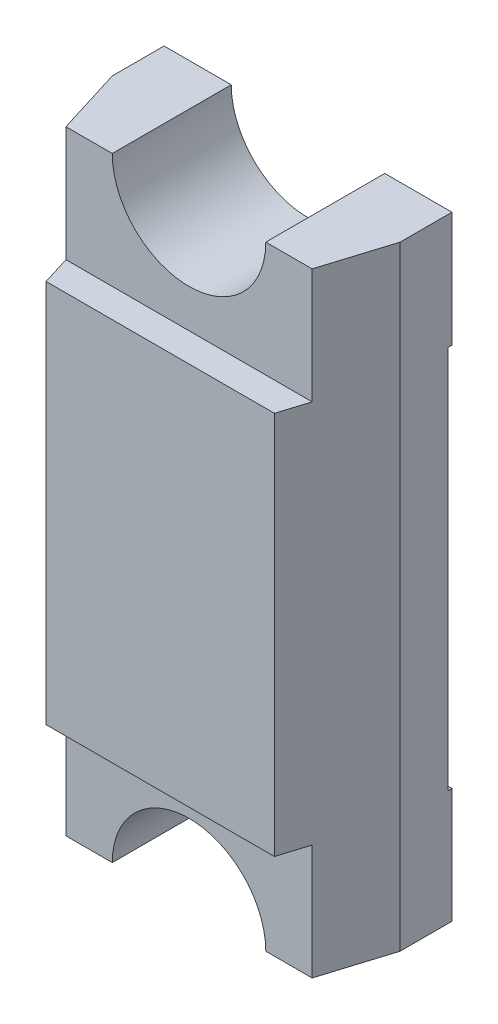
ISO-10303-21;
HEADER;
FILE_DESCRIPTION(('STEP AP214'),'2;1');
FILE_NAME('part.step','',(''),(''),'','','');
FILE_SCHEMA(('AUTOMOTIVE_DESIGN { 1 0 10303 214 1 1 1 1 }'));
ENDSEC;
DATA;
#1=APPLICATION_CONTEXT('core data for automotive mechanical design processes');
#2=APPLICATION_PROTOCOL_DEFINITION('international standard','automotive_design',2000,#1);
#3=PRODUCT_CONTEXT('',#1,'mechanical');
#4=PRODUCT('Part','Part','',(#3));
#5=PRODUCT_RELATED_PRODUCT_CATEGORY('part','',(#4));
#6=PRODUCT_DEFINITION_FORMATION('','',#4);
#7=PRODUCT_DEFINITION_CONTEXT('part definition',#1,'design');
#8=PRODUCT_DEFINITION('design','',#6,#7);
#9=PRODUCT_DEFINITION_SHAPE('','',#8);
#10=(LENGTH_UNIT() NAMED_UNIT(*) SI_UNIT(.MILLI.,.METRE.));
#11=(NAMED_UNIT(*) PLANE_ANGLE_UNIT() SI_UNIT($,.RADIAN.));
#12=(NAMED_UNIT(*) SI_UNIT($,.STERADIAN.) SOLID_ANGLE_UNIT());
#13=UNCERTAINTY_MEASURE_WITH_UNIT(LENGTH_MEASURE(1.E-05),#10,'distance_accuracy_value','');
#14=(GEOMETRIC_REPRESENTATION_CONTEXT(3) GLOBAL_UNCERTAINTY_ASSIGNED_CONTEXT((#13)) GLOBAL_UNIT_ASSIGNED_CONTEXT((#10,
#11,#12)) REPRESENTATION_CONTEXT('',''));
#15=CARTESIAN_POINT('',(0.,0.,0.));
#16=DIRECTION('',(0.,0.,1.));
#17=DIRECTION('',(1.,0.,0.));
#18=AXIS2_PLACEMENT_3D('',#15,#16,#17);
#19=CARTESIAN_POINT('',(0.,-1.6,0.));
#20=DIRECTION('',(0.,0.,-1.));
#21=DIRECTION('',(-1.,0.,0.));
#22=AXIS2_PLACEMENT_3D('',#19,#20,#21);
#23=PLANE('',#22);
#24=DIRECTION('',(0.,-1.,0.));
#25=VECTOR('',#24,1.);
#26=CARTESIAN_POINT('',(-0.0416666666666698,0.458333333333333,0.));
#27=LINE('',#26,#25);
#28=CARTESIAN_POINT('',(-0.0416666666666698,0.458333333333333,0.));
#29=VERTEX_POINT('',#28);
#30=CARTESIAN_POINT('',(-0.0416666666666698,0.013888888888889,0.));
#31=VERTEX_POINT('',#30);
#32=EDGE_CURVE('E636',#29,#31,#27,.T.);
#33=ORIENTED_EDGE('',*,*,#32,.T.);
#34=DIRECTION('',(1.,0.,0.));
#35=VECTOR('',#34,1.);
#36=CARTESIAN_POINT('',(-0.0416666666666698,0.013888888888889,0.));
#37=LINE('',#36,#35);
#38=CARTESIAN_POINT('',(0.173611111111108,0.0138888888888888,0.));
#39=VERTEX_POINT('',#38);
#40=EDGE_CURVE('E633',#31,#39,#37,.T.);
#41=ORIENTED_EDGE('',*,*,#40,.T.);
#42=DIRECTION('',(0.,1.,0.));
#43=VECTOR('',#42,1.);
#44=CARTESIAN_POINT('',(0.173611111111108,0.013888888888889,0.));
#45=LINE('',#44,#43);
#46=CARTESIAN_POINT('',(0.173611111111108,0.458333333333333,0.));
#47=VERTEX_POINT('',#46);
#48=EDGE_CURVE('E630',#39,#47,#45,.T.);
#49=ORIENTED_EDGE('',*,*,#48,.T.);
#50=DIRECTION('',(1.,0.,0.));
#51=VECTOR('',#50,1.);
#52=CARTESIAN_POINT('',(0.173611111111108,0.458333333333333,0.));
#53=LINE('',#52,#51);
#54=CARTESIAN_POINT('',(0.548611111111108,0.458333333333333,0.));
#55=VERTEX_POINT('',#54);
#56=EDGE_CURVE('E627',#47,#55,#53,.T.);
#57=ORIENTED_EDGE('',*,*,#56,.T.);
#58=DIRECTION('',(0.,1.,0.));
#59=VECTOR('',#58,1.);
#60=CARTESIAN_POINT('',(0.548611111111108,0.458333333333333,0.));
#61=LINE('',#60,#59);
#62=CARTESIAN_POINT('',(0.548611111111108,0.513888888888889,0.));
#63=VERTEX_POINT('',#62);
#64=EDGE_CURVE('E624',#55,#63,#61,.T.);
#65=ORIENTED_EDGE('',*,*,#64,.T.);
#66=DIRECTION('',(-1.,0.,0.));
#67=VECTOR('',#66,1.);
#68=CARTESIAN_POINT('',(0.548611111111108,0.513888888888889,0.));
#69=LINE('',#68,#67);
#70=CARTESIAN_POINT('',(-0.41666666666667,0.513888888888889,0.));
#71=VERTEX_POINT('',#70);
#72=EDGE_CURVE('E620',#63,#71,#69,.T.);
#73=ORIENTED_EDGE('',*,*,#72,.T.);
#74=DIRECTION('',(0.,-1.,0.));
#75=VECTOR('',#74,1.);
#76=CARTESIAN_POINT('',(-0.41666666666667,0.513888888888889,0.));
#77=LINE('',#76,#75);
#78=CARTESIAN_POINT('',(-0.41666666666667,0.458333333333333,0.));
#79=VERTEX_POINT('',#78);
#80=EDGE_CURVE('E642',#71,#79,#77,.T.);
#81=ORIENTED_EDGE('',*,*,#80,.T.);
#82=DIRECTION('',(1.,0.,0.));
#83=VECTOR('',#82,1.);
#84=CARTESIAN_POINT('',(-0.41666666666667,0.458333333333333,0.));
#85=LINE('',#84,#83);
#86=EDGE_CURVE('E639',#79,#29,#85,.T.);
#87=ORIENTED_EDGE('',*,*,#86,.T.);
#88=EDGE_LOOP('',(#33,#41,#49,#57,#65,#73,#81,#87));
#89=FACE_BOUND('',#88,.T.);
#90=DIRECTION('',(0.,1.,0.));
#91=VECTOR('',#90,1.);
#92=CARTESIAN_POINT('',(0.75,1.6,0.));
#93=LINE('',#92,#91);
#94=CARTESIAN_POINT('',(0.75,-1.,0.));
#95=VERTEX_POINT('',#94);
#96=CARTESIAN_POINT('',(0.75,1.,0.));
#97=VERTEX_POINT('',#96);
#98=EDGE_CURVE('E728',#95,#97,#93,.T.);
#99=ORIENTED_EDGE('',*,*,#98,.F.);
#100=DIRECTION('',(1.,0.,0.));
#101=VECTOR('',#100,1.);
#102=CARTESIAN_POINT('',(0.75,-1.,0.));
#103=LINE('',#102,#101);
#104=CARTESIAN_POINT('',(-0.75,-1.,0.));
#105=VERTEX_POINT('',#104);
#106=EDGE_CURVE('E544',#105,#95,#103,.T.);
#107=ORIENTED_EDGE('',*,*,#106,.F.);
#108=DIRECTION('',(0.,-1.,0.));
#109=VECTOR('',#108,1.);
#110=CARTESIAN_POINT('',(-0.75,1.6,0.));
#111=LINE('',#110,#109);
#112=CARTESIAN_POINT('',(-0.75,1.,0.));
#113=VERTEX_POINT('',#112);
#114=EDGE_CURVE('E725',#113,#105,#111,.T.);
#115=ORIENTED_EDGE('',*,*,#114,.F.);
#116=DIRECTION('',(-1.,0.,0.));
#117=VECTOR('',#116,1.);
#118=CARTESIAN_POINT('',(0.75,1.,0.));
#119=LINE('',#118,#117);
#120=EDGE_CURVE('E558',#97,#113,#119,.T.);
#121=ORIENTED_EDGE('',*,*,#120,.F.);
#122=EDGE_LOOP('',(#99,#107,#115,#121));
#123=FACE_BOUND('',#122,.T.);
#124=ADVANCED_FACE('F347',(#89,#123),#23,.T.);
#125=CARTESIAN_POINT('',(-0.75,1.6,0.75));
#126=DIRECTION('',(1.,0.,0.));
#127=DIRECTION('',(0.,0.,-1.));
#128=AXIS2_PLACEMENT_3D('',#125,#126,#127);
#129=PLANE('',#128);
#130=DIRECTION('',(0.,0.,-1.));
#131=VECTOR('',#130,1.);
#132=CARTESIAN_POINT('',(-0.75,-1.6,0.75));
#133=LINE('',#132,#131);
#134=CARTESIAN_POINT('',(-0.75,-1.6,0.25));
#135=VERTEX_POINT('',#134);
#136=CARTESIAN_POINT('',(-0.75,-1.6,-0.02));
#137=VERTEX_POINT('',#136);
#138=EDGE_CURVE('E740',#135,#137,#133,.T.);
#139=ORIENTED_EDGE('',*,*,#138,.F.);
#140=DIRECTION('',(0.,1.,0.));
#141=VECTOR('',#140,1.);
#142=CARTESIAN_POINT('',(-0.75,-4.375,0.25));
#143=LINE('',#142,#141);
#144=CARTESIAN_POINT('',(-0.75,1.6,0.25));
#145=VERTEX_POINT('',#144);
#146=EDGE_CURVE('E600',#135,#145,#143,.T.);
#147=ORIENTED_EDGE('',*,*,#146,.T.);
#148=DIRECTION('',(0.,0.,-1.));
#149=VECTOR('',#148,1.);
#150=CARTESIAN_POINT('',(-0.75,1.6,0.75));
#151=LINE('',#150,#149);
#152=CARTESIAN_POINT('',(-0.75,1.6,-0.02));
#153=VERTEX_POINT('',#152);
#154=EDGE_CURVE('E730',#145,#153,#151,.T.);
#155=ORIENTED_EDGE('',*,*,#154,.T.);
#156=DIRECTION('',(0.,1.,0.));
#157=VECTOR('',#156,1.);
#158=CARTESIAN_POINT('',(-0.75,1.6,-0.02));
#159=LINE('',#158,#157);
#160=CARTESIAN_POINT('',(-0.75,1.,-0.02));
#161=VERTEX_POINT('',#160);
#162=EDGE_CURVE('E564',#161,#153,#159,.T.);
#163=ORIENTED_EDGE('',*,*,#162,.F.);
#164=DIRECTION('',(0.,0.,1.));
#165=VECTOR('',#164,1.);
#166=CARTESIAN_POINT('',(-0.75,1.,-0.02));
#167=LINE('',#166,#165);
#168=EDGE_CURVE('E576',#161,#113,#167,.T.);
#169=ORIENTED_EDGE('',*,*,#168,.T.);
#170=ORIENTED_EDGE('',*,*,#114,.T.);
#171=DIRECTION('',(0.,0.,1.));
#172=VECTOR('',#171,1.);
#173=CARTESIAN_POINT('',(-0.75,-1.,-0.02));
#174=LINE('',#173,#172);
#175=CARTESIAN_POINT('',(-0.75,-1.,-0.02));
#176=VERTEX_POINT('',#175);
#177=EDGE_CURVE('E556',#176,#105,#174,.T.);
#178=ORIENTED_EDGE('',*,*,#177,.F.);
#179=DIRECTION('',(0.,1.,0.));
#180=VECTOR('',#179,1.);
#181=CARTESIAN_POINT('',(-0.75,-1.6,-0.02));
#182=LINE('',#181,#180);
#183=EDGE_CURVE('E552',#137,#176,#182,.T.);
#184=ORIENTED_EDGE('',*,*,#183,.F.);
#185=EDGE_LOOP('',(#139,#147,#155,#163,#169,#170,#178,#184));
#186=FACE_BOUND('',#185,.T.);
#187=ADVANCED_FACE('F349',(#186),#129,.F.);
#188=CARTESIAN_POINT('',(-0.75,-1.6,0.75));
#189=DIRECTION('',(0.,1.,0.));
#190=DIRECTION('',(0.,0.,1.));
#191=AXIS2_PLACEMENT_3D('',#188,#189,#190);
#192=PLANE('',#191);
#193=DIRECTION('',(1.,0.,0.));
#194=VECTOR('',#193,1.);
#195=CARTESIAN_POINT('',(-0.751,-1.6,0.6));
#196=LINE('',#195,#194);
#197=CARTESIAN_POINT('',(-0.641511286589969,-1.6,0.6));
#198=VERTEX_POINT('',#197);
#199=CARTESIAN_POINT('',(-0.4,-1.6,0.6));
#200=VERTEX_POINT('',#199);
#201=EDGE_CURVE('E704',#198,#200,#196,.T.);
#202=ORIENTED_EDGE('',*,*,#201,.F.);
#203=DIRECTION('',(-0.296070669880944,0.,-0.955166037103628));
#204=VECTOR('',#203,1.);
#205=CARTESIAN_POINT('',(-0.608601675773601,-1.6,0.706171079218124));
#206=LINE('',#205,#204);
#207=EDGE_CURVE('E607',#198,#135,#206,.T.);
#208=ORIENTED_EDGE('',*,*,#207,.T.);
#209=ORIENTED_EDGE('',*,*,#138,.T.);
#210=DIRECTION('',(-1.,0.,0.));
#211=VECTOR('',#210,1.);
#212=CARTESIAN_POINT('',(-0.4,-1.6,-0.02));
#213=LINE('',#212,#211);
#214=CARTESIAN_POINT('',(-0.4,-1.6,-0.02));
#215=VERTEX_POINT('',#214);
#216=EDGE_CURVE('E549',#215,#137,#213,.T.);
#217=ORIENTED_EDGE('',*,*,#216,.F.);
#218=DIRECTION('',(0.,0.,-1.));
#219=VECTOR('',#218,1.);
#220=CARTESIAN_POINT('',(-0.4,-1.6,0.75));
#221=LINE('',#220,#219);
#222=EDGE_CURVE('E738',#200,#215,#221,.T.);
#223=ORIENTED_EDGE('',*,*,#222,.F.);
#224=EDGE_LOOP('',(#202,#208,#209,#217,#223));
#225=FACE_BOUND('',#224,.T.);
#226=ADVANCED_FACE('F759',(#225),#192,.F.);
#227=CARTESIAN_POINT('',(0.,-1.6,0.75));
#228=DIRECTION('',(0.,0.,-1.));
#229=DIRECTION('',(-1.,0.,0.));
#230=AXIS2_PLACEMENT_3D('',#227,#228,#229);
#231=CYLINDRICAL_SURFACE('',#230,0.4);
#232=DIRECTION('',(0.,0.,-1.));
#233=VECTOR('',#232,1.);
#234=CARTESIAN_POINT('',(0.4,-1.6,0.75));
#235=LINE('',#234,#233);
#236=CARTESIAN_POINT('',(0.4,-1.6,0.6));
#237=VERTEX_POINT('',#236);
#238=CARTESIAN_POINT('',(0.4,-1.6,-0.02));
#239=VERTEX_POINT('',#238);
#240=EDGE_CURVE('E528',#237,#239,#235,.T.);
#241=ORIENTED_EDGE('',*,*,#240,.F.);
#242=CARTESIAN_POINT('',(0.,-1.6,0.6));
#243=DIRECTION('',(0.,0.,-1.));
#244=DIRECTION('',(-1.,0.,0.));
#245=AXIS2_PLACEMENT_3D('',#242,#243,#244);
#246=CIRCLE('',#245,0.4);
#247=EDGE_CURVE('E702',#200,#237,#246,.T.);
#248=ORIENTED_EDGE('',*,*,#247,.F.);
#249=ORIENTED_EDGE('',*,*,#222,.T.);
#250=CARTESIAN_POINT('',(0.,-1.6,-0.02));
#251=DIRECTION('',(0.,0.,1.));
#252=DIRECTION('',(1.,0.,0.));
#253=AXIS2_PLACEMENT_3D('',#250,#251,#252);
#254=CIRCLE('',#253,0.4);
#255=EDGE_CURVE('E539',#239,#215,#254,.T.);
#256=ORIENTED_EDGE('',*,*,#255,.F.);
#257=EDGE_LOOP('',(#241,#248,#249,#256));
#258=FACE_BOUND('',#257,.T.);
#259=ADVANCED_FACE('F754',(#258),#231,.F.);
#260=CARTESIAN_POINT('',(0.4,-1.6,0.75));
#261=DIRECTION('',(0.,1.,0.));
#262=DIRECTION('',(0.,0.,1.));
#263=AXIS2_PLACEMENT_3D('',#260,#261,#262);
#264=PLANE('',#263);
#265=DIRECTION('',(0.,0.,-1.));
#266=VECTOR('',#265,1.);
#267=CARTESIAN_POINT('',(0.75,-1.6,0.75));
#268=LINE('',#267,#266);
#269=CARTESIAN_POINT('',(0.75,-1.6,0.25));
#270=VERTEX_POINT('',#269);
#271=CARTESIAN_POINT('',(0.75,-1.6,-0.02));
#272=VERTEX_POINT('',#271);
#273=EDGE_CURVE('E519',#270,#272,#268,.T.);
#274=ORIENTED_EDGE('',*,*,#273,.F.);
#275=DIRECTION('',(-0.296070669880953,0.,0.955166037103625));
#276=VECTOR('',#275,1.);
#277=CARTESIAN_POINT('',(0.577921431226282,-1.6,0.805149906176604));
#278=LINE('',#277,#276);
#279=CARTESIAN_POINT('',(0.641511286589965,-1.6,0.6));
#280=VERTEX_POINT('',#279);
#281=EDGE_CURVE('E588',#270,#280,#278,.T.);
#282=ORIENTED_EDGE('',*,*,#281,.T.);
#283=DIRECTION('',(1.,0.,0.));
#284=VECTOR('',#283,1.);
#285=CARTESIAN_POINT('',(-0.751,-1.6,0.6));
#286=LINE('',#285,#284);
#287=EDGE_CURVE('E697',#237,#280,#286,.T.);
#288=ORIENTED_EDGE('',*,*,#287,.F.);
#289=ORIENTED_EDGE('',*,*,#240,.T.);
#290=DIRECTION('',(-1.,0.,0.));
#291=VECTOR('',#290,1.);
#292=CARTESIAN_POINT('',(0.75,-1.6,-0.02));
#293=LINE('',#292,#291);
#294=EDGE_CURVE('E532',#272,#239,#293,.T.);
#295=ORIENTED_EDGE('',*,*,#294,.F.);
#296=EDGE_LOOP('',(#274,#282,#288,#289,#295));
#297=FACE_BOUND('',#296,.T.);
#298=ADVANCED_FACE('F533',(#297),#264,.F.);
#299=CARTESIAN_POINT('',(0.75,1.6,0.75));
#300=DIRECTION('',(-1.,0.,0.));
#301=DIRECTION('',(0.,0.,1.));
#302=AXIS2_PLACEMENT_3D('',#299,#300,#301);
#303=PLANE('',#302);
#304=DIRECTION('',(0.,0.,-1.));
#305=VECTOR('',#304,1.);
#306=CARTESIAN_POINT('',(0.75,1.6,0.75));
#307=LINE('',#306,#305);
#308=CARTESIAN_POINT('',(0.75,1.6,0.25));
#309=VERTEX_POINT('',#308);
#310=CARTESIAN_POINT('',(0.75,1.6,-0.02));
#311=VERTEX_POINT('',#310);
#312=EDGE_CURVE('E529',#309,#311,#307,.T.);
#313=ORIENTED_EDGE('',*,*,#312,.F.);
#314=DIRECTION('',(0.,1.,0.));
#315=VECTOR('',#314,1.);
#316=CARTESIAN_POINT('',(0.75,-4.375,0.25));
#317=LINE('',#316,#315);
#318=EDGE_CURVE('E525',#270,#309,#317,.T.);
#319=ORIENTED_EDGE('',*,*,#318,.F.);
#320=ORIENTED_EDGE('',*,*,#273,.T.);
#321=DIRECTION('',(0.,-1.,0.));
#322=VECTOR('',#321,1.);
#323=CARTESIAN_POINT('',(0.75,-1.,-0.02));
#324=LINE('',#323,#322);
#325=CARTESIAN_POINT('',(0.75,-1.,-0.02));
#326=VERTEX_POINT('',#325);
#327=EDGE_CURVE('E524',#326,#272,#324,.T.);
#328=ORIENTED_EDGE('',*,*,#327,.F.);
#329=DIRECTION('',(0.,0.,1.));
#330=VECTOR('',#329,1.);
#331=CARTESIAN_POINT('',(0.75,-1.,-0.02));
#332=LINE('',#331,#330);
#333=EDGE_CURVE('E362',#326,#95,#332,.T.);
#334=ORIENTED_EDGE('',*,*,#333,.T.);
#335=ORIENTED_EDGE('',*,*,#98,.T.);
#336=DIRECTION('',(0.,0.,1.));
#337=VECTOR('',#336,1.);
#338=CARTESIAN_POINT('',(0.75,1.,-0.02));
#339=LINE('',#338,#337);
#340=CARTESIAN_POINT('',(0.75,1.,-0.02));
#341=VERTEX_POINT('',#340);
#342=EDGE_CURVE('E580',#341,#97,#339,.T.);
#343=ORIENTED_EDGE('',*,*,#342,.F.);
#344=DIRECTION('',(0.,-1.,0.));
#345=VECTOR('',#344,1.);
#346=CARTESIAN_POINT('',(0.75,1.,-0.02));
#347=LINE('',#346,#345);
#348=EDGE_CURVE('E559',#311,#341,#347,.T.);
#349=ORIENTED_EDGE('',*,*,#348,.F.);
#350=EDGE_LOOP('',(#313,#319,#320,#328,#334,#335,#343,#349));
#351=FACE_BOUND('',#350,.T.);
#352=ADVANCED_FACE('F522',(#351),#303,.F.);
#353=CARTESIAN_POINT('',(0.4,1.6,0.75));
#354=DIRECTION('',(0.,-1.,0.));
#355=DIRECTION('',(0.,0.,-1.));
#356=AXIS2_PLACEMENT_3D('',#353,#354,#355);
#357=PLANE('',#356);
#358=DIRECTION('',(-1.,0.,0.));
#359=VECTOR('',#358,1.);
#360=CARTESIAN_POINT('',(-0.751,1.6,0.6));
#361=LINE('',#360,#359);
#362=CARTESIAN_POINT('',(0.641511286589965,1.6,0.6));
#363=VERTEX_POINT('',#362);
#364=CARTESIAN_POINT('',(0.4,1.6,0.6));
#365=VERTEX_POINT('',#364);
#366=EDGE_CURVE('E710',#363,#365,#361,.T.);
#367=ORIENTED_EDGE('',*,*,#366,.F.);
#368=DIRECTION('',(0.296070669880953,0.,-0.955166037103625));
#369=VECTOR('',#368,1.);
#370=CARTESIAN_POINT('',(0.577921431226282,1.6,0.805149906176604));
#371=LINE('',#370,#369);
#372=EDGE_CURVE('E596',#363,#309,#371,.T.);
#373=ORIENTED_EDGE('',*,*,#372,.T.);
#374=ORIENTED_EDGE('',*,*,#312,.T.);
#375=DIRECTION('',(1.,0.,0.));
#376=VECTOR('',#375,1.);
#377=CARTESIAN_POINT('',(0.75,1.6,-0.02));
#378=LINE('',#377,#376);
#379=CARTESIAN_POINT('',(0.4,1.6,-0.02));
#380=VERTEX_POINT('',#379);
#381=EDGE_CURVE('E573',#380,#311,#378,.T.);
#382=ORIENTED_EDGE('',*,*,#381,.F.);
#383=DIRECTION('',(0.,0.,-1.));
#384=VECTOR('',#383,1.);
#385=CARTESIAN_POINT('',(0.4,1.6,0.75));
#386=LINE('',#385,#384);
#387=EDGE_CURVE('E734',#365,#380,#386,.T.);
#388=ORIENTED_EDGE('',*,*,#387,.F.);
#389=EDGE_LOOP('',(#367,#373,#374,#382,#388));
#390=FACE_BOUND('',#389,.T.);
#391=ADVANCED_FACE('F782',(#390),#357,.F.);
#392=CARTESIAN_POINT('',(0.,1.6,0.75));
#393=DIRECTION('',(0.,0.,-1.));
#394=DIRECTION('',(-1.,0.,0.));
#395=AXIS2_PLACEMENT_3D('',#392,#393,#394);
#396=CYLINDRICAL_SURFACE('',#395,0.4);
#397=DIRECTION('',(0.,0.,-1.));
#398=VECTOR('',#397,1.);
#399=CARTESIAN_POINT('',(-0.4,1.6,0.75));
#400=LINE('',#399,#398);
#401=CARTESIAN_POINT('',(-0.4,1.6,0.6));
#402=VERTEX_POINT('',#401);
#403=CARTESIAN_POINT('',(-0.4,1.6,-0.02));
#404=VERTEX_POINT('',#403);
#405=EDGE_CURVE('E732',#402,#404,#400,.T.);
#406=ORIENTED_EDGE('',*,*,#405,.F.);
#407=CARTESIAN_POINT('',(0.,1.6,0.6));
#408=DIRECTION('',(0.,0.,-1.));
#409=DIRECTION('',(-1.,0.,0.));
#410=AXIS2_PLACEMENT_3D('',#407,#408,#409);
#411=CIRCLE('',#410,0.4);
#412=EDGE_CURVE('E723',#365,#402,#411,.T.);
#413=ORIENTED_EDGE('',*,*,#412,.F.);
#414=ORIENTED_EDGE('',*,*,#387,.T.);
#415=CARTESIAN_POINT('',(0.,1.6,-0.02));
#416=DIRECTION('',(0.,0.,1.));
#417=DIRECTION('',(-1.,0.,0.));
#418=AXIS2_PLACEMENT_3D('',#415,#416,#417);
#419=CIRCLE('',#418,0.4);
#420=EDGE_CURVE('E570',#404,#380,#419,.T.);
#421=ORIENTED_EDGE('',*,*,#420,.F.);
#422=EDGE_LOOP('',(#406,#413,#414,#421));
#423=FACE_BOUND('',#422,.T.);
#424=ADVANCED_FACE('F800',(#423),#396,.F.);
#425=CARTESIAN_POINT('',(-0.75,1.6,0.75));
#426=DIRECTION('',(0.,-1.,0.));
#427=DIRECTION('',(0.,0.,-1.));
#428=AXIS2_PLACEMENT_3D('',#425,#426,#427);
#429=PLANE('',#428);
#430=ORIENTED_EDGE('',*,*,#154,.F.);
#431=DIRECTION('',(0.296070669880944,0.,0.955166037103628));
#432=VECTOR('',#431,1.);
#433=CARTESIAN_POINT('',(-0.608601675773601,1.6,0.706171079218124));
#434=LINE('',#433,#432);
#435=CARTESIAN_POINT('',(-0.641511286589969,1.6,0.6));
#436=VERTEX_POINT('',#435);
#437=EDGE_CURVE('E616',#145,#436,#434,.T.);
#438=ORIENTED_EDGE('',*,*,#437,.T.);
#439=DIRECTION('',(-1.,0.,0.));
#440=VECTOR('',#439,1.);
#441=CARTESIAN_POINT('',(-0.751,1.6,0.6));
#442=LINE('',#441,#440);
#443=EDGE_CURVE('E718',#402,#436,#442,.T.);
#444=ORIENTED_EDGE('',*,*,#443,.F.);
#445=ORIENTED_EDGE('',*,*,#405,.T.);
#446=DIRECTION('',(1.,0.,0.));
#447=VECTOR('',#446,1.);
#448=CARTESIAN_POINT('',(-0.4,1.6,-0.02));
#449=LINE('',#448,#447);
#450=EDGE_CURVE('E567',#153,#404,#449,.T.);
#451=ORIENTED_EDGE('',*,*,#450,.F.);
#452=EDGE_LOOP('',(#430,#438,#444,#445,#451));
#453=FACE_BOUND('',#452,.T.);
#454=ADVANCED_FACE('F796',(#453),#429,.F.);
#455=CARTESIAN_POINT('',(0.,-1.6,0.75));
#456=DIRECTION('',(0.,0.,-1.));
#457=DIRECTION('',(-1.,0.,0.));
#458=AXIS2_PLACEMENT_3D('',#455,#456,#457);
#459=PLANE('',#458);
#460=DIRECTION('',(1.,0.,0.));
#461=VECTOR('',#460,1.);
#462=CARTESIAN_POINT('',(-0.751,-1.,0.75));
#463=LINE('',#462,#461);
#464=CARTESIAN_POINT('',(-0.595016123699956,-1.,0.75));
#465=VERTEX_POINT('',#464);
#466=CARTESIAN_POINT('',(0.595016123699949,-1.,0.75));
#467=VERTEX_POINT('',#466);
#468=EDGE_CURVE('E707',#465,#467,#463,.T.);
#469=ORIENTED_EDGE('',*,*,#468,.T.);
#470=DIRECTION('',(0.,1.,0.));
#471=VECTOR('',#470,1.);
#472=CARTESIAN_POINT('',(0.595016123699949,-4.375,0.750000000000005));
#473=LINE('',#472,#471);
#474=CARTESIAN_POINT('',(0.595016123699949,1.,0.750000000000005));
#475=VERTEX_POINT('',#474);
#476=EDGE_CURVE('E370',#467,#475,#473,.T.);
#477=ORIENTED_EDGE('',*,*,#476,.T.);
#478=DIRECTION('',(1.,0.,0.));
#479=VECTOR('',#478,1.);
#480=CARTESIAN_POINT('',(-0.751,1.,0.75));
#481=LINE('',#480,#479);
#482=CARTESIAN_POINT('',(-0.595016123699956,1.,0.75));
#483=VERTEX_POINT('',#482);
#484=EDGE_CURVE('E715',#483,#475,#481,.T.);
#485=ORIENTED_EDGE('',*,*,#484,.F.);
#486=DIRECTION('',(0.,1.,0.));
#487=VECTOR('',#486,1.);
#488=CARTESIAN_POINT('',(-0.595016123699956,-4.375,0.75));
#489=LINE('',#488,#487);
#490=EDGE_CURVE('E599',#465,#483,#489,.T.);
#491=ORIENTED_EDGE('',*,*,#490,.F.);
#492=EDGE_LOOP('',(#469,#477,#485,#491));
#493=FACE_BOUND('',#492,.T.);
#494=ADVANCED_FACE('F792',(#493),#459,.F.);
#495=CARTESIAN_POINT('',(-0.751,1.,0.6));
#496=DIRECTION('',(0.,-1.,0.));
#497=DIRECTION('',(0.,0.,-1.));
#498=AXIS2_PLACEMENT_3D('',#495,#496,#497);
#499=PLANE('',#498);
#500=ORIENTED_EDGE('',*,*,#484,.T.);
#501=DIRECTION('',(0.296070669880953,0.,-0.955166037103625));
#502=VECTOR('',#501,1.);
#503=CARTESIAN_POINT('',(0.51944675285432,1.,0.993797524780347));
#504=LINE('',#503,#502);
#505=CARTESIAN_POINT('',(0.641511286589965,1.,0.6));
#506=VERTEX_POINT('',#505);
#507=EDGE_CURVE('E593',#475,#506,#504,.T.);
#508=ORIENTED_EDGE('',*,*,#507,.T.);
#509=DIRECTION('',(1.,0.,0.));
#510=VECTOR('',#509,1.);
#511=CARTESIAN_POINT('',(-0.751,1.,0.6));
#512=LINE('',#511,#510);
#513=CARTESIAN_POINT('',(-0.641511286589969,1.,0.6));
#514=VERTEX_POINT('',#513);
#515=EDGE_CURVE('E714',#514,#506,#512,.T.);
#516=ORIENTED_EDGE('',*,*,#515,.F.);
#517=DIRECTION('',(0.296070669880944,0.,0.955166037103628));
#518=VECTOR('',#517,1.);
#519=CARTESIAN_POINT('',(-0.651108830883084,1.,0.569036958804234));
#520=LINE('',#519,#518);
#521=EDGE_CURVE('E613',#514,#483,#520,.T.);
#522=ORIENTED_EDGE('',*,*,#521,.T.);
#523=EDGE_LOOP('',(#500,#508,#516,#522));
#524=FACE_BOUND('',#523,.T.);
#525=ADVANCED_FACE('F789',(#524),#499,.F.);
#526=CARTESIAN_POINT('',(-0.751,1.,0.6));
#527=DIRECTION('',(0.,0.,-1.));
#528=DIRECTION('',(-1.,0.,0.));
#529=AXIS2_PLACEMENT_3D('',#526,#527,#528);
#530=PLANE('',#529);
#531=ORIENTED_EDGE('',*,*,#515,.T.);
#532=DIRECTION('',(0.,1.,0.));
#533=VECTOR('',#532,1.);
#534=CARTESIAN_POINT('',(0.641511286589965,1.,0.6));
#535=LINE('',#534,#533);
#536=EDGE_CURVE('E590',#506,#363,#535,.T.);
#537=ORIENTED_EDGE('',*,*,#536,.T.);
#538=ORIENTED_EDGE('',*,*,#366,.T.);
#539=ORIENTED_EDGE('',*,*,#412,.T.);
#540=ORIENTED_EDGE('',*,*,#443,.T.);
#541=DIRECTION('',(0.,-1.,0.));
#542=VECTOR('',#541,1.);
#543=CARTESIAN_POINT('',(-0.641511286589969,1.,0.6));
#544=LINE('',#543,#542);
#545=EDGE_CURVE('E610',#436,#514,#544,.T.);
#546=ORIENTED_EDGE('',*,*,#545,.T.);
#547=EDGE_LOOP('',(#531,#537,#538,#539,#540,#546));
#548=FACE_BOUND('',#547,.T.);
#549=ADVANCED_FACE('F785',(#548),#530,.F.);
#550=CARTESIAN_POINT('',(-0.751,-1.,0.6));
#551=DIRECTION('',(0.,0.,-1.));
#552=DIRECTION('',(-1.,0.,0.));
#553=AXIS2_PLACEMENT_3D('',#550,#551,#552);
#554=PLANE('',#553);
#555=ORIENTED_EDGE('',*,*,#287,.T.);
#556=DIRECTION('',(0.,1.,0.));
#557=VECTOR('',#556,1.);
#558=CARTESIAN_POINT('',(0.641511286589965,-1.,0.6));
#559=LINE('',#558,#557);
#560=CARTESIAN_POINT('',(0.641511286589965,-1.,0.6));
#561=VERTEX_POINT('',#560);
#562=EDGE_CURVE('E584',#280,#561,#559,.T.);
#563=ORIENTED_EDGE('',*,*,#562,.T.);
#564=DIRECTION('',(1.,0.,0.));
#565=VECTOR('',#564,1.);
#566=CARTESIAN_POINT('',(-0.751,-1.,0.6));
#567=LINE('',#566,#565);
#568=CARTESIAN_POINT('',(-0.641511286589969,-1.,0.6));
#569=VERTEX_POINT('',#568);
#570=EDGE_CURVE('E706',#569,#561,#567,.T.);
#571=ORIENTED_EDGE('',*,*,#570,.F.);
#572=DIRECTION('',(0.,-1.,0.));
#573=VECTOR('',#572,1.);
#574=CARTESIAN_POINT('',(-0.641511286589969,-1.,0.6));
#575=LINE('',#574,#573);
#576=EDGE_CURVE('E603',#569,#198,#575,.T.);
#577=ORIENTED_EDGE('',*,*,#576,.T.);
#578=ORIENTED_EDGE('',*,*,#201,.T.);
#579=ORIENTED_EDGE('',*,*,#247,.T.);
#580=EDGE_LOOP('',(#555,#563,#571,#577,#578,#579));
#581=FACE_BOUND('',#580,.T.);
#582=ADVANCED_FACE('F749',(#581),#554,.F.);
#583=CARTESIAN_POINT('',(-0.751,-1.,0.6));
#584=DIRECTION('',(0.,1.,0.));
#585=DIRECTION('',(0.,0.,1.));
#586=AXIS2_PLACEMENT_3D('',#583,#584,#585);
#587=PLANE('',#586);
#588=ORIENTED_EDGE('',*,*,#570,.T.);
#589=DIRECTION('',(-0.296070669880953,0.,0.955166037103625));
#590=VECTOR('',#589,1.);
#591=CARTESIAN_POINT('',(0.51944675285432,-1.,0.993797524780347));
#592=LINE('',#591,#590);
#593=EDGE_CURVE('E13',#561,#467,#592,.T.);
#594=ORIENTED_EDGE('',*,*,#593,.T.);
#595=ORIENTED_EDGE('',*,*,#468,.F.);
#596=DIRECTION('',(-0.296070669880944,0.,-0.955166037103628));
#597=VECTOR('',#596,1.);
#598=CARTESIAN_POINT('',(-0.651108830883084,-1.,0.569036958804234));
#599=LINE('',#598,#597);
#600=EDGE_CURVE('E355',#465,#569,#599,.T.);
#601=ORIENTED_EDGE('',*,*,#600,.T.);
#602=EDGE_LOOP('',(#588,#594,#595,#601));
#603=FACE_BOUND('',#602,.T.);
#604=ADVANCED_FACE('F745',(#603),#587,.F.);
#605=CARTESIAN_POINT('',(-0.0416666666666698,0.458333333333333,0.));
#606=DIRECTION('',(1.,0.,0.));
#607=DIRECTION('',(0.,-1.,0.));
#608=AXIS2_PLACEMENT_3D('',#605,#606,#607);
#609=PLANE('',#608);
#610=DIRECTION('',(0.,0.,1.));
#611=VECTOR('',#610,1.);
#612=CARTESIAN_POINT('',(-0.0416666666666698,0.458333333333333,0.));
#613=LINE('',#612,#611);
#614=CARTESIAN_POINT('',(-0.0416666666666698,0.458333333333333,-0.01));
#615=VERTEX_POINT('',#614);
#616=EDGE_CURVE('E694',#615,#29,#613,.T.);
#617=ORIENTED_EDGE('',*,*,#616,.F.);
#618=DIRECTION('',(0.,1.,0.));
#619=VECTOR('',#618,1.);
#620=CARTESIAN_POINT('',(-0.0416666666666698,-1.6,-0.01));
#621=LINE('',#620,#619);
#622=CARTESIAN_POINT('',(-0.0416666666666698,0.013888888888889,-0.01));
#623=VERTEX_POINT('',#622);
#624=EDGE_CURVE('E669',#615,#623,#621,.F.);
#625=ORIENTED_EDGE('',*,*,#624,.T.);
#626=DIRECTION('',(0.,0.,1.));
#627=VECTOR('',#626,1.);
#628=CARTESIAN_POINT('',(-0.0416666666666698,0.013888888888889,0.));
#629=LINE('',#628,#627);
#630=EDGE_CURVE('E691',#623,#31,#629,.T.);
#631=ORIENTED_EDGE('',*,*,#630,.T.);
#632=ORIENTED_EDGE('',*,*,#32,.F.);
#633=EDGE_LOOP('',(#617,#625,#631,#632));
#634=FACE_BOUND('',#633,.T.);
#635=ADVANCED_FACE('F827',(#634),#609,.F.);
#636=CARTESIAN_POINT('',(-0.0416666666666698,0.013888888888889,0.));
#637=DIRECTION('',(0.,1.,0.));
#638=DIRECTION('',(1.,0.,0.));
#639=AXIS2_PLACEMENT_3D('',#636,#637,#638);
#640=PLANE('',#639);
#641=ORIENTED_EDGE('',*,*,#630,.F.);
#642=DIRECTION('',(-1.,0.,0.));
#643=VECTOR('',#642,1.);
#644=CARTESIAN_POINT('',(0.,0.013888888888889,-0.01));
#645=LINE('',#644,#643);
#646=CARTESIAN_POINT('',(0.173611111111108,0.013888888888889,-0.01));
#647=VERTEX_POINT('',#646);
#648=EDGE_CURVE('E665',#623,#647,#645,.F.);
#649=ORIENTED_EDGE('',*,*,#648,.T.);
#650=DIRECTION('',(0.,0.,1.));
#651=VECTOR('',#650,1.);
#652=CARTESIAN_POINT('',(0.173611111111108,0.013888888888889,0.));
#653=LINE('',#652,#651);
#654=EDGE_CURVE('E688',#647,#39,#653,.T.);
#655=ORIENTED_EDGE('',*,*,#654,.T.);
#656=ORIENTED_EDGE('',*,*,#40,.F.);
#657=EDGE_LOOP('',(#641,#649,#655,#656));
#658=FACE_BOUND('',#657,.T.);
#659=ADVANCED_FACE('F836',(#658),#640,.F.);
#660=CARTESIAN_POINT('',(0.173611111111108,0.013888888888889,0.));
#661=DIRECTION('',(-1.,0.,0.));
#662=DIRECTION('',(0.,1.,0.));
#663=AXIS2_PLACEMENT_3D('',#660,#661,#662);
#664=PLANE('',#663);
#665=ORIENTED_EDGE('',*,*,#654,.F.);
#666=DIRECTION('',(0.,1.,0.));
#667=VECTOR('',#666,1.);
#668=CARTESIAN_POINT('',(0.173611111111108,-1.6,-0.01));
#669=LINE('',#668,#667);
#670=CARTESIAN_POINT('',(0.173611111111108,0.458333333333333,-0.01));
#671=VERTEX_POINT('',#670);
#672=EDGE_CURVE('E661',#647,#671,#669,.T.);
#673=ORIENTED_EDGE('',*,*,#672,.T.);
#674=DIRECTION('',(0.,0.,1.));
#675=VECTOR('',#674,1.);
#676=CARTESIAN_POINT('',(0.173611111111108,0.458333333333333,0.));
#677=LINE('',#676,#675);
#678=EDGE_CURVE('E685',#671,#47,#677,.T.);
#679=ORIENTED_EDGE('',*,*,#678,.T.);
#680=ORIENTED_EDGE('',*,*,#48,.F.);
#681=EDGE_LOOP('',(#665,#673,#679,#680));
#682=FACE_BOUND('',#681,.T.);
#683=ADVANCED_FACE('F840',(#682),#664,.F.);
#684=CARTESIAN_POINT('',(0.173611111111108,0.458333333333333,0.));
#685=DIRECTION('',(0.,1.,0.));
#686=DIRECTION('',(1.,0.,0.));
#687=AXIS2_PLACEMENT_3D('',#684,#685,#686);
#688=PLANE('',#687);
#689=ORIENTED_EDGE('',*,*,#678,.F.);
#690=DIRECTION('',(-1.,0.,0.));
#691=VECTOR('',#690,1.);
#692=CARTESIAN_POINT('',(0.,0.458333333333333,-0.01));
#693=LINE('',#692,#691);
#694=CARTESIAN_POINT('',(0.548611111111108,0.458333333333333,-0.01));
#695=VERTEX_POINT('',#694);
#696=EDGE_CURVE('E657',#671,#695,#693,.F.);
#697=ORIENTED_EDGE('',*,*,#696,.T.);
#698=DIRECTION('',(0.,0.,1.));
#699=VECTOR('',#698,1.);
#700=CARTESIAN_POINT('',(0.548611111111108,0.458333333333333,0.));
#701=LINE('',#700,#699);
#702=EDGE_CURVE('E682',#695,#55,#701,.T.);
#703=ORIENTED_EDGE('',*,*,#702,.T.);
#704=ORIENTED_EDGE('',*,*,#56,.F.);
#705=EDGE_LOOP('',(#689,#697,#703,#704));
#706=FACE_BOUND('',#705,.T.);
#707=ADVANCED_FACE('F844',(#706),#688,.F.);
#708=CARTESIAN_POINT('',(0.548611111111108,0.458333333333333,0.));
#709=DIRECTION('',(-1.,0.,0.));
#710=DIRECTION('',(0.,1.,0.));
#711=AXIS2_PLACEMENT_3D('',#708,#709,#710);
#712=PLANE('',#711);
#713=ORIENTED_EDGE('',*,*,#702,.F.);
#714=DIRECTION('',(0.,1.,0.));
#715=VECTOR('',#714,1.);
#716=CARTESIAN_POINT('',(0.548611111111108,-1.6,-0.01));
#717=LINE('',#716,#715);
#718=CARTESIAN_POINT('',(0.548611111111108,0.513888888888889,-0.01));
#719=VERTEX_POINT('',#718);
#720=EDGE_CURVE('E653',#695,#719,#717,.T.);
#721=ORIENTED_EDGE('',*,*,#720,.T.);
#722=DIRECTION('',(0.,0.,1.));
#723=VECTOR('',#722,1.);
#724=CARTESIAN_POINT('',(0.548611111111108,0.513888888888889,0.));
#725=LINE('',#724,#723);
#726=EDGE_CURVE('E679',#719,#63,#725,.T.);
#727=ORIENTED_EDGE('',*,*,#726,.T.);
#728=ORIENTED_EDGE('',*,*,#64,.F.);
#729=EDGE_LOOP('',(#713,#721,#727,#728));
#730=FACE_BOUND('',#729,.T.);
#731=ADVANCED_FACE('F848',(#730),#712,.F.);
#732=CARTESIAN_POINT('',(0.548611111111108,0.513888888888889,0.));
#733=DIRECTION('',(0.,-1.,0.));
#734=DIRECTION('',(-1.,0.,0.));
#735=AXIS2_PLACEMENT_3D('',#732,#733,#734);
#736=PLANE('',#735);
#737=ORIENTED_EDGE('',*,*,#726,.F.);
#738=DIRECTION('',(-1.,0.,0.));
#739=VECTOR('',#738,1.);
#740=CARTESIAN_POINT('',(0.,0.513888888888889,-0.01));
#741=LINE('',#740,#739);
#742=CARTESIAN_POINT('',(-0.41666666666667,0.513888888888889,-0.01));
#743=VERTEX_POINT('',#742);
#744=EDGE_CURVE('E645',#719,#743,#741,.T.);
#745=ORIENTED_EDGE('',*,*,#744,.T.);
#746=DIRECTION('',(0.,0.,1.));
#747=VECTOR('',#746,1.);
#748=CARTESIAN_POINT('',(-0.41666666666667,0.513888888888889,0.));
#749=LINE('',#748,#747);
#750=EDGE_CURVE('E676',#743,#71,#749,.T.);
#751=ORIENTED_EDGE('',*,*,#750,.T.);
#752=ORIENTED_EDGE('',*,*,#72,.F.);
#753=EDGE_LOOP('',(#737,#745,#751,#752));
#754=FACE_BOUND('',#753,.T.);
#755=ADVANCED_FACE('F852',(#754),#736,.F.);
#756=CARTESIAN_POINT('',(-0.41666666666667,0.513888888888889,0.));
#757=DIRECTION('',(1.,0.,0.));
#758=DIRECTION('',(0.,-1.,0.));
#759=AXIS2_PLACEMENT_3D('',#756,#757,#758);
#760=PLANE('',#759);
#761=ORIENTED_EDGE('',*,*,#750,.F.);
#762=DIRECTION('',(0.,1.,0.));
#763=VECTOR('',#762,1.);
#764=CARTESIAN_POINT('',(-0.41666666666667,-1.6,-0.01));
#765=LINE('',#764,#763);
#766=CARTESIAN_POINT('',(-0.41666666666667,0.458333333333333,-0.01));
#767=VERTEX_POINT('',#766);
#768=EDGE_CURVE('E619',#743,#767,#765,.F.);
#769=ORIENTED_EDGE('',*,*,#768,.T.);
#770=DIRECTION('',(0.,0.,1.));
#771=VECTOR('',#770,1.);
#772=CARTESIAN_POINT('',(-0.41666666666667,0.458333333333333,0.));
#773=LINE('',#772,#771);
#774=EDGE_CURVE('E623',#767,#79,#773,.T.);
#775=ORIENTED_EDGE('',*,*,#774,.T.);
#776=ORIENTED_EDGE('',*,*,#80,.F.);
#777=EDGE_LOOP('',(#761,#769,#775,#776));
#778=FACE_BOUND('',#777,.T.);
#779=ADVANCED_FACE('F832',(#778),#760,.F.);
#780=CARTESIAN_POINT('',(-0.41666666666667,0.458333333333333,0.));
#781=DIRECTION('',(0.,1.,0.));
#782=DIRECTION('',(1.,0.,0.));
#783=AXIS2_PLACEMENT_3D('',#780,#781,#782);
#784=PLANE('',#783);
#785=DIRECTION('',(-1.,0.,0.));
#786=VECTOR('',#785,1.);
#787=CARTESIAN_POINT('',(0.,0.458333333333333,-0.01));
#788=LINE('',#787,#786);
#789=EDGE_CURVE('E649',#767,#615,#788,.F.);
#790=ORIENTED_EDGE('',*,*,#789,.T.);
#791=ORIENTED_EDGE('',*,*,#616,.T.);
#792=ORIENTED_EDGE('',*,*,#86,.F.);
#793=ORIENTED_EDGE('',*,*,#774,.F.);
#794=EDGE_LOOP('',(#790,#791,#792,#793));
#795=FACE_BOUND('',#794,.T.);
#796=ADVANCED_FACE('F828',(#795),#784,.F.);
#797=CARTESIAN_POINT('',(0.,-1.6,-0.01));
#798=DIRECTION('',(0.,0.,-1.));
#799=DIRECTION('',(-1.,0.,0.));
#800=AXIS2_PLACEMENT_3D('',#797,#798,#799);
#801=PLANE('',#800);
#802=ORIENTED_EDGE('',*,*,#768,.F.);
#803=ORIENTED_EDGE('',*,*,#744,.F.);
#804=ORIENTED_EDGE('',*,*,#720,.F.);
#805=ORIENTED_EDGE('',*,*,#696,.F.);
#806=ORIENTED_EDGE('',*,*,#672,.F.);
#807=ORIENTED_EDGE('',*,*,#648,.F.);
#808=ORIENTED_EDGE('',*,*,#624,.F.);
#809=ORIENTED_EDGE('',*,*,#789,.F.);
#810=EDGE_LOOP('',(#802,#803,#804,#805,#806,#807,#808,#809));
#811=FACE_BOUND('',#810,.T.);
#812=ADVANCED_FACE('F831',(#811),#801,.T.);
#813=CARTESIAN_POINT('',(-0.75,-4.375,0.25));
#814=DIRECTION('',(0.955166037103628,0.,-0.296070669880944));
#815=DIRECTION('',(-0.296070669880944,0.,-0.955166037103628));
#816=AXIS2_PLACEMENT_3D('',#813,#814,#815);
#817=PLANE('',#816);
#818=ORIENTED_EDGE('',*,*,#146,.F.);
#819=ORIENTED_EDGE('',*,*,#207,.F.);
#820=ORIENTED_EDGE('',*,*,#576,.F.);
#821=ORIENTED_EDGE('',*,*,#600,.F.);
#822=ORIENTED_EDGE('',*,*,#490,.T.);
#823=ORIENTED_EDGE('',*,*,#521,.F.);
#824=ORIENTED_EDGE('',*,*,#545,.F.);
#825=ORIENTED_EDGE('',*,*,#437,.F.);
#826=EDGE_LOOP('',(#818,#819,#820,#821,#822,#823,#824,#825));
#827=FACE_BOUND('',#826,.T.);
#828=ADVANCED_FACE('F793',(#827),#817,.F.);
#829=CARTESIAN_POINT('',(0.75,-4.375,0.25));
#830=DIRECTION('',(-0.955166037103625,0.,-0.296070669880953));
#831=DIRECTION('',(-0.296070669880953,0.,0.955166037103625));
#832=AXIS2_PLACEMENT_3D('',#829,#830,#831);
#833=PLANE('',#832);
#834=ORIENTED_EDGE('',*,*,#536,.F.);
#835=ORIENTED_EDGE('',*,*,#507,.F.);
#836=ORIENTED_EDGE('',*,*,#476,.F.);
#837=ORIENTED_EDGE('',*,*,#593,.F.);
#838=ORIENTED_EDGE('',*,*,#562,.F.);
#839=ORIENTED_EDGE('',*,*,#281,.F.);
#840=ORIENTED_EDGE('',*,*,#318,.T.);
#841=ORIENTED_EDGE('',*,*,#372,.F.);
#842=EDGE_LOOP('',(#834,#835,#836,#837,#838,#839,#840,#841));
#843=FACE_BOUND('',#842,.T.);
#844=ADVANCED_FACE('F751',(#843),#833,.F.);
#845=CARTESIAN_POINT('',(0.75,1.,-0.02));
#846=DIRECTION('',(0.,1.,0.));
#847=DIRECTION('',(0.,0.,1.));
#848=AXIS2_PLACEMENT_3D('',#845,#846,#847);
#849=PLANE('',#848);
#850=ORIENTED_EDGE('',*,*,#120,.T.);
#851=ORIENTED_EDGE('',*,*,#168,.F.);
#852=DIRECTION('',(-1.,0.,0.));
#853=VECTOR('',#852,1.);
#854=CARTESIAN_POINT('',(0.75,1.,-0.02));
#855=LINE('',#854,#853);
#856=EDGE_CURVE('E562',#341,#161,#855,.T.);
#857=ORIENTED_EDGE('',*,*,#856,.F.);
#858=ORIENTED_EDGE('',*,*,#342,.T.);
#859=EDGE_LOOP('',(#850,#851,#857,#858));
#860=FACE_BOUND('',#859,.T.);
#861=ADVANCED_FACE('F774',(#860),#849,.F.);
#862=CARTESIAN_POINT('',(0.,1.6,-0.02));
#863=DIRECTION('',(0.,0.,-1.));
#864=DIRECTION('',(-1.,0.,0.));
#865=AXIS2_PLACEMENT_3D('',#862,#863,#864);
#866=PLANE('',#865);
#867=ORIENTED_EDGE('',*,*,#348,.T.);
#868=ORIENTED_EDGE('',*,*,#856,.T.);
#869=ORIENTED_EDGE('',*,*,#162,.T.);
#870=ORIENTED_EDGE('',*,*,#450,.T.);
#871=ORIENTED_EDGE('',*,*,#420,.T.);
#872=ORIENTED_EDGE('',*,*,#381,.T.);
#873=EDGE_LOOP('',(#867,#868,#869,#870,#871,#872));
#874=FACE_BOUND('',#873,.T.);
#875=ADVANCED_FACE('F778',(#874),#866,.T.);
#876=CARTESIAN_POINT('',(0.75,-1.,-0.02));
#877=DIRECTION('',(0.,-1.,0.));
#878=DIRECTION('',(0.,0.,-1.));
#879=AXIS2_PLACEMENT_3D('',#876,#877,#878);
#880=PLANE('',#879);
#881=ORIENTED_EDGE('',*,*,#106,.T.);
#882=ORIENTED_EDGE('',*,*,#333,.F.);
#883=DIRECTION('',(1.,0.,0.));
#884=VECTOR('',#883,1.);
#885=CARTESIAN_POINT('',(0.75,-1.,-0.02));
#886=LINE('',#885,#884);
#887=EDGE_CURVE('E543',#176,#326,#886,.T.);
#888=ORIENTED_EDGE('',*,*,#887,.F.);
#889=ORIENTED_EDGE('',*,*,#177,.T.);
#890=EDGE_LOOP('',(#881,#882,#888,#889));
#891=FACE_BOUND('',#890,.T.);
#892=ADVANCED_FACE('F767',(#891),#880,.F.);
#893=CARTESIAN_POINT('',(0.,-1.6,-0.02));
#894=DIRECTION('',(0.,0.,1.));
#895=DIRECTION('',(1.,0.,0.));
#896=AXIS2_PLACEMENT_3D('',#893,#894,#895);
#897=PLANE('',#896);
#898=ORIENTED_EDGE('',*,*,#327,.T.);
#899=ORIENTED_EDGE('',*,*,#294,.T.);
#900=ORIENTED_EDGE('',*,*,#255,.T.);
#901=ORIENTED_EDGE('',*,*,#216,.T.);
#902=ORIENTED_EDGE('',*,*,#183,.T.);
#903=ORIENTED_EDGE('',*,*,#887,.T.);
#904=EDGE_LOOP('',(#898,#899,#900,#901,#902,#903));
#905=FACE_BOUND('',#904,.T.);
#906=ADVANCED_FACE('F541',(#905),#897,.F.);
#907=CLOSED_SHELL('',(#124,#187,#226,#259,#298,#352,#391,#424,#454,#494,#525,#549,#582,#604,
#635,#659,#683,#707,#731,#755,#779,#796,#812,#828,#844,#861,#875,#892,#906));
#908=MANIFOLD_SOLID_BREP('B2',#907);
#909=ADVANCED_BREP_SHAPE_REPRESENTATION('',(#18,#908),#14);
#910=SHAPE_DEFINITION_REPRESENTATION(#9,#909);
ENDSEC;
END-ISO-10303-21;
